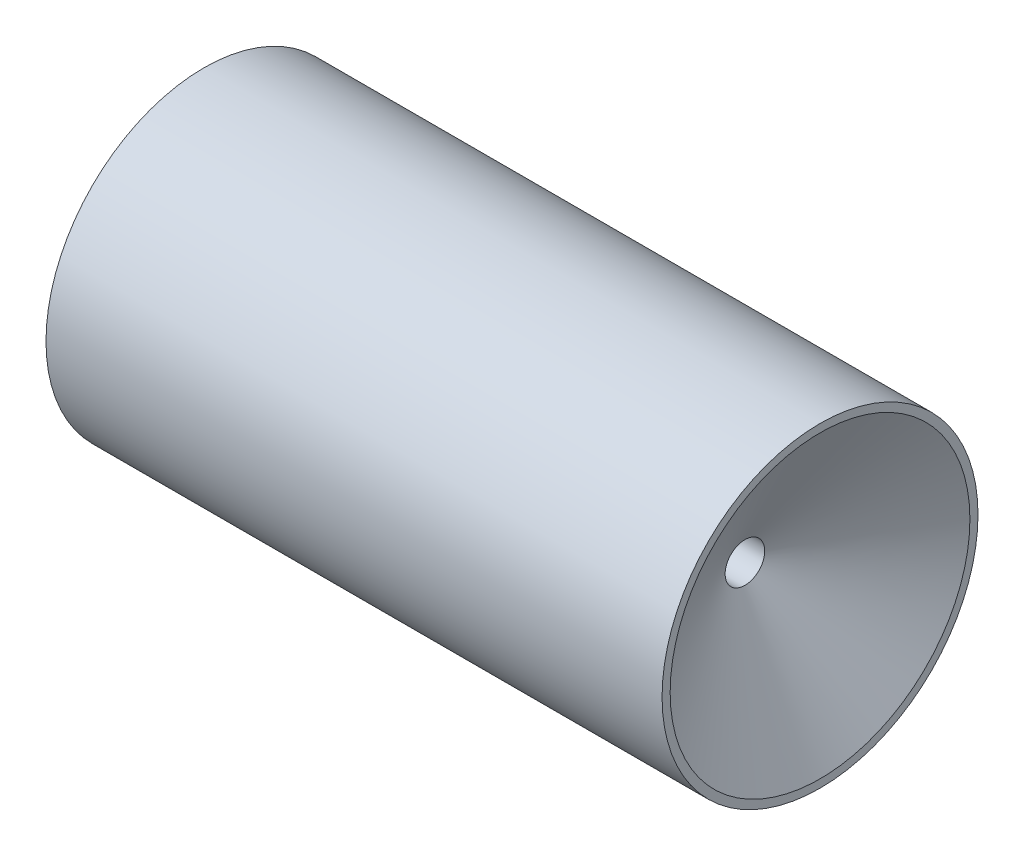
ISO-10303-21;
HEADER;
FILE_DESCRIPTION(('STEP AP214'),'2;1');
FILE_NAME('part.step','',(''),(''),'','','');
FILE_SCHEMA(('AUTOMOTIVE_DESIGN { 1 0 10303 214 1 1 1 1 }'));
ENDSEC;
DATA;
#1=APPLICATION_CONTEXT('core data for automotive mechanical design processes');
#2=APPLICATION_PROTOCOL_DEFINITION('international standard','automotive_design',2000,#1);
#3=PRODUCT_CONTEXT('',#1,'mechanical');
#4=PRODUCT('Part','Part','',(#3));
#5=PRODUCT_RELATED_PRODUCT_CATEGORY('part','',(#4));
#6=PRODUCT_DEFINITION_FORMATION('','',#4);
#7=PRODUCT_DEFINITION_CONTEXT('part definition',#1,'design');
#8=PRODUCT_DEFINITION('design','',#6,#7);
#9=PRODUCT_DEFINITION_SHAPE('','',#8);
#10=(LENGTH_UNIT() NAMED_UNIT(*) SI_UNIT(.MILLI.,.METRE.));
#11=(NAMED_UNIT(*) PLANE_ANGLE_UNIT() SI_UNIT($,.RADIAN.));
#12=(NAMED_UNIT(*) SI_UNIT($,.STERADIAN.) SOLID_ANGLE_UNIT());
#13=UNCERTAINTY_MEASURE_WITH_UNIT(LENGTH_MEASURE(1.E-05),#10,'distance_accuracy_value','');
#14=(GEOMETRIC_REPRESENTATION_CONTEXT(3) GLOBAL_UNCERTAINTY_ASSIGNED_CONTEXT((#13)) GLOBAL_UNIT_ASSIGNED_CONTEXT((#10,
#11,#12)) REPRESENTATION_CONTEXT('',''));
#15=CARTESIAN_POINT('',(0.,0.,0.));
#16=DIRECTION('',(0.,0.,1.));
#17=DIRECTION('',(1.,0.,0.));
#18=AXIS2_PLACEMENT_3D('',#15,#16,#17);
#19=CARTESIAN_POINT('',(-78.,9.99999999999999,0.));
#20=DIRECTION('',(-1.,0.,0.));
#21=DIRECTION('',(0.,0.,1.));
#22=AXIS2_PLACEMENT_3D('',#19,#20,#21);
#23=PLANE('',#22);
#24=CARTESIAN_POINT('',(-78.,0.,0.));
#25=DIRECTION('',(1.,0.,0.));
#26=DIRECTION('',(0.,0.,-1.));
#27=AXIS2_PLACEMENT_3D('',#24,#25,#26);
#28=CIRCLE('',#27,9.99999999999999);
#29=CARTESIAN_POINT('',(-78.,0.,9.99999999999999));
#30=VERTEX_POINT('',#29);
#31=EDGE_CURVE('E55',#30,#30,#28,.T.);
#32=ORIENTED_EDGE('',*,*,#31,.T.);
#33=EDGE_LOOP('',(#32));
#34=FACE_BOUND('',#33,.T.);
#35=CARTESIAN_POINT('',(-78.,0.,0.));
#36=DIRECTION('',(1.,0.,0.));
#37=DIRECTION('',(0.,0.,-1.));
#38=AXIS2_PLACEMENT_3D('',#35,#36,#37);
#39=CIRCLE('',#38,20.);
#40=CARTESIAN_POINT('',(-78.,0.,-20.));
#41=VERTEX_POINT('',#40);
#42=EDGE_CURVE('E10',#41,#41,#39,.T.);
#43=ORIENTED_EDGE('',*,*,#42,.F.);
#44=EDGE_LOOP('',(#43));
#45=FACE_BOUND('',#44,.T.);
#46=ADVANCED_FACE('F33',(#34,#45),#23,.T.);
#47=CARTESIAN_POINT('',(11.2723845428841,0.,0.));
#48=DIRECTION('',(1.,0.,0.));
#49=DIRECTION('',(0.,0.,-1.));
#50=AXIS2_PLACEMENT_3D('',#47,#48,#49);
#51=CYLINDRICAL_SURFACE('',#50,20.);
#52=ORIENTED_EDGE('',*,*,#42,.T.);
#53=EDGE_LOOP('',(#52));
#54=FACE_BOUND('',#53,.T.);
#55=CARTESIAN_POINT('',(0.,0.,0.));
#56=DIRECTION('',(1.,0.,0.));
#57=DIRECTION('',(0.,0.,-1.));
#58=AXIS2_PLACEMENT_3D('',#55,#56,#57);
#59=CIRCLE('',#58,20.);
#60=CARTESIAN_POINT('',(0.,0.,-20.));
#61=VERTEX_POINT('',#60);
#62=EDGE_CURVE('E39',#61,#61,#59,.T.);
#63=ORIENTED_EDGE('',*,*,#62,.F.);
#64=EDGE_LOOP('',(#63));
#65=FACE_BOUND('',#64,.T.);
#66=ADVANCED_FACE('F73',(#54,#65),#51,.T.);
#67=CARTESIAN_POINT('',(0.,20.,0.));
#68=DIRECTION('',(1.,0.,0.));
#69=DIRECTION('',(0.,0.,-1.));
#70=AXIS2_PLACEMENT_3D('',#67,#68,#69);
#71=PLANE('',#70);
#72=ORIENTED_EDGE('',*,*,#62,.T.);
#73=EDGE_LOOP('',(#72));
#74=FACE_BOUND('',#73,.T.);
#75=CARTESIAN_POINT('',(0.,0.,0.));
#76=DIRECTION('',(1.,0.,0.));
#77=DIRECTION('',(0.,0.,-1.));
#78=AXIS2_PLACEMENT_3D('',#75,#76,#77);
#79=CIRCLE('',#78,18.9760569613425);
#80=CARTESIAN_POINT('',(0.,0.,-18.9760569613425));
#81=VERTEX_POINT('',#80);
#82=EDGE_CURVE('E43',#81,#81,#79,.T.);
#83=ORIENTED_EDGE('',*,*,#82,.F.);
#84=EDGE_LOOP('',(#83));
#85=FACE_BOUND('',#84,.T.);
#86=ADVANCED_FACE('F77',(#74,#85),#71,.T.);
#87=CARTESIAN_POINT('',(-9.50841939862651,0.,0.));
#88=DIRECTION('',(1.,0.,0.));
#89=DIRECTION('',(0.,0.,-1.));
#90=AXIS2_PLACEMENT_3D('',#87,#88,#89);
#91=CONICAL_SURFACE('',#90,2.50699146324803,1.04719755119659);
#92=CARTESIAN_POINT('',(-9.50841939862651,0.,0.));
#93=DIRECTION('',(1.,0.,0.));
#94=DIRECTION('',(0.,0.,-1.));
#95=AXIS2_PLACEMENT_3D('',#92,#93,#94);
#96=CIRCLE('',#95,2.50699146324803);
#97=CARTESIAN_POINT('',(-9.50841939862651,0.,-2.50699146324803));
#98=VERTEX_POINT('',#97);
#99=EDGE_CURVE('E47',#98,#98,#96,.T.);
#100=CARTESIAN_POINT('',(0.,0.,-18.9760569613425));
#101=CARTESIAN_POINT('',(-0.0990460354023613,0.,-18.8045041957373));
#102=CARTESIAN_POINT('',(-0.198092070804721,0.,-18.6329514301322));
#103=CARTESIAN_POINT('',(-0.39618414160944,0.,-18.2898458989219));
#104=CARTESIAN_POINT('',(-0.495230177011799,0.,-18.1182931333167));
#105=CARTESIAN_POINT('',(-0.693322247816518,0.,-17.7751876021064));
#106=CARTESIAN_POINT('',(-0.792368283218878,0.,-17.6036348365013));
#107=CARTESIAN_POINT('',(-0.990460354023597,0.,-17.260529305291));
#108=CARTESIAN_POINT('',(-1.08950638942596,0.,-17.0889765396858));
#109=CARTESIAN_POINT('',(-1.28759846023067,0.,-16.7458710084755));
#110=CARTESIAN_POINT('',(-1.38664449563303,0.,-16.5743182428704));
#111=CARTESIAN_POINT('',(-1.58473656643775,0.,-16.2312127116601));
#112=CARTESIAN_POINT('',(-1.68378260184011,0.,-16.0596599460549));
#113=CARTESIAN_POINT('',(-1.88187467264483,0.,-15.7165544148446));
#114=CARTESIAN_POINT('',(-1.98092070804719,0.,-15.5450016492395));
#115=CARTESIAN_POINT('',(-2.17901277885191,0.,-15.2018961180292));
#116=CARTESIAN_POINT('',(-2.27805881425427,0.,-15.030343352424));
#117=CARTESIAN_POINT('',(-2.47615088505899,0.,-14.6872378212137));
#118=CARTESIAN_POINT('',(-2.57519692046135,0.,-14.5156850556086));
#119=CARTESIAN_POINT('',(-2.77328899126607,0.,-14.1725795243983));
#120=CARTESIAN_POINT('',(-2.87233502666843,0.,-14.0010267587931));
#121=CARTESIAN_POINT('',(-3.07042709747314,0.,-13.6579212275828));
#122=CARTESIAN_POINT('',(-3.1694731328755,0.,-13.4863684619777));
#123=CARTESIAN_POINT('',(-3.36756520368022,0.,-13.1432629307674));
#124=CARTESIAN_POINT('',(-3.46661123908258,0.,-12.9717101651622));
#125=CARTESIAN_POINT('',(-3.6647033098873,0.,-12.6286046339519));
#126=CARTESIAN_POINT('',(-3.76374934528966,0.,-12.4570518683468));
#127=CARTESIAN_POINT('',(-3.96184141609438,0.,-12.1139463371365));
#128=CARTESIAN_POINT('',(-4.06088745149674,0.,-11.9423935715313));
#129=CARTESIAN_POINT('',(-4.25897952230146,0.,-11.599288040321));
#130=CARTESIAN_POINT('',(-4.35802555770382,0.,-11.4277352747159));
#131=CARTESIAN_POINT('',(-4.55611762850853,0.,-11.0846297435056));
#132=CARTESIAN_POINT('',(-4.65516366391089,0.,-10.9130769779004));
#133=CARTESIAN_POINT('',(-4.85325573471561,0.,-10.5699714466901));
#134=CARTESIAN_POINT('',(-4.95230177011797,0.,-10.3984186810849));
#135=CARTESIAN_POINT('',(-5.15039384092269,0.,-10.0553131498746));
#136=CARTESIAN_POINT('',(-5.24943987632505,0.,-9.8837603842695));
#137=CARTESIAN_POINT('',(-5.44753194712977,0.,-9.5406548530592));
#138=CARTESIAN_POINT('',(-5.54657798253213,0.,-9.36910208745405));
#139=CARTESIAN_POINT('',(-5.74467005333685,0.,-9.02599655624375));
#140=CARTESIAN_POINT('',(-5.84371608873921,0.,-8.8544437906386));
#141=CARTESIAN_POINT('',(-6.04180815954393,0.,-8.51133825942829));
#142=CARTESIAN_POINT('',(-6.14085419494629,0.,-8.33978549382315));
#143=CARTESIAN_POINT('',(-6.338946265751,0.,-7.99667996261284));
#144=CARTESIAN_POINT('',(-6.43799230115336,0.,-7.8251271970077));
#145=CARTESIAN_POINT('',(-6.63608437195808,0.,-7.48202166579739));
#146=CARTESIAN_POINT('',(-6.73513040736044,0.,-7.31046890019224));
#147=CARTESIAN_POINT('',(-6.93322247816516,0.,-6.96736336898194));
#148=CARTESIAN_POINT('',(-7.03226851356752,0.,-6.79581060337679));
#149=CARTESIAN_POINT('',(-7.23036058437224,0.,-6.45270507216649));
#150=CARTESIAN_POINT('',(-7.3294066197746,0.,-6.28115230656134));
#151=CARTESIAN_POINT('',(-7.52749869057932,0.,-5.93804677535104));
#152=CARTESIAN_POINT('',(-7.62654472598168,0.,-5.76649400974589));
#153=CARTESIAN_POINT('',(-7.8246367967864,0.,-5.42338847853559));
#154=CARTESIAN_POINT('',(-7.92368283218875,0.,-5.25183571293044));
#155=CARTESIAN_POINT('',(-8.12177490299347,0.,-4.90873018172014));
#156=CARTESIAN_POINT('',(-8.22082093839583,0.,-4.73717741611499));
#157=CARTESIAN_POINT('',(-8.41891300920055,0.,-4.39407188490469));
#158=CARTESIAN_POINT('',(-8.51795904460291,0.,-4.22251911929954));
#159=CARTESIAN_POINT('',(-8.71605111540763,0.,-3.87941358808924));
#160=CARTESIAN_POINT('',(-8.81509715080999,0.,-3.70786082248409));
#161=CARTESIAN_POINT('',(-9.01318922161471,0.,-3.36475529127379));
#162=CARTESIAN_POINT('',(-9.11223525701707,0.,-3.19320252566864));
#163=CARTESIAN_POINT('',(-9.31032732782179,0.,-2.85009699445833));
#164=CARTESIAN_POINT('',(-9.40937336322415,0.,-2.67854422885318));
#165=CARTESIAN_POINT('',(-9.50841939862651,0.,-2.50699146324803));
#166=B_SPLINE_CURVE_WITH_KNOTS('',3,(#100,#101,#102,#103,#104,#105,#106,#107,#108,#109,#110,
#111,#112,#113,#114,#115,#116,#117,#118,#119,#120,#121,#122,#123,#124,#125,#126,#127,#128,#129,
#130,#131,#132,#133,#134,#135,#136,#137,#138,#139,#140,#141,#142,#143,#144,#145,#146,#147,#148,
#149,#150,#151,#152,#153,#154,#155,#156,#157,#158,#159,#160,#161,#162,#163,#164,#165),
.UNSPECIFIED.,.F.,.F.,(4,2,2,2,2,2,2,2,2,2,2,2,2,2,2,2,2,2,2,2,2,2,2,2,2,2,2,2,2,2,2,2,4),(0.,
0.594276212414152,1.1885524248283,1.78282863724246,2.37710484965661,2.97138106207076,
3.56565727448491,4.15993348689906,4.75420969931321,5.34848591172737,5.94276212414152,
6.53703833655567,7.13131454896982,7.72559076138397,8.31986697379812,8.91414318621228,
9.50841939862643,10.1026956110406,10.6969718234547,11.2912480358689,11.885524248283,
12.4798004606972,13.0740766731113,13.6683528855255,14.2626290979396,14.8569053103538,
15.4511815227679,16.0454577351821,16.6397339475962,17.2340101600104,17.8282863724245,
18.4225625848387,19.0168387972529),.UNSPECIFIED.);
#167=EDGE_CURVE('BSEAM69',#81,#98,#166,.T.);
#168=ORIENTED_EDGE('',*,*,#82,.T.);
#169=ORIENTED_EDGE('',*,*,#99,.F.);
#170=ORIENTED_EDGE('',*,*,#167,.T.);
#171=ORIENTED_EDGE('',*,*,#167,.F.);
#172=EDGE_LOOP('',(#168,#170,#169,#171));
#173=FACE_BOUND('',#172,.T.);
#174=ADVANCED_FACE('F69',(#173),#91,.F.);
#175=CARTESIAN_POINT('',(11.2723845428841,0.,0.));
#176=DIRECTION('',(1.,0.,0.));
#177=DIRECTION('',(0.,0.,-1.));
#178=AXIS2_PLACEMENT_3D('',#175,#176,#177);
#179=CYLINDRICAL_SURFACE('',#178,2.50699146324803);
#180=ORIENTED_EDGE('',*,*,#99,.T.);
#181=EDGE_LOOP('',(#180));
#182=FACE_BOUND('',#181,.T.);
#183=CARTESIAN_POINT('',(-50.0357114392944,0.,0.));
#184=DIRECTION('',(1.,0.,0.));
#185=DIRECTION('',(0.,0.,-1.));
#186=AXIS2_PLACEMENT_3D('',#183,#184,#185);
#187=CIRCLE('',#186,2.50699146324804);
#188=CARTESIAN_POINT('',(-50.0357114392945,0.,2.50699146324804));
#189=VERTEX_POINT('',#188);
#190=EDGE_CURVE('E52',#189,#189,#187,.T.);
#191=ORIENTED_EDGE('',*,*,#190,.F.);
#192=EDGE_LOOP('',(#191));
#193=FACE_BOUND('',#192,.T.);
#194=ADVANCED_FACE('F63',(#182,#193),#179,.F.);
#195=CARTESIAN_POINT('',(-78.,0.,0.));
#196=DIRECTION('',(-1.,0.,0.));
#197=DIRECTION('',(0.,0.,1.));
#198=AXIS2_PLACEMENT_3D('',#195,#196,#197);
#199=CONICAL_SURFACE('',#198,9.99999999999999,0.26179938779915);
#200=CARTESIAN_POINT('',(-50.0357114392945,0.,2.50699146324804));
#201=CARTESIAN_POINT('',(-50.3270061118018,0.,2.58504363550587));
#202=CARTESIAN_POINT('',(-50.6183007843091,0.,2.6630958077637));
#203=CARTESIAN_POINT('',(-51.2008901293239,0.,2.81920015227937));
#204=CARTESIAN_POINT('',(-51.4921848018312,0.,2.8972523245372));
#205=CARTESIAN_POINT('',(-52.0747741468459,0.,3.05335666905287));
#206=CARTESIAN_POINT('',(-52.3660688193532,0.,3.1314088413107));
#207=CARTESIAN_POINT('',(-52.9486581643679,0.,3.28751318582637));
#208=CARTESIAN_POINT('',(-53.2399528368753,0.,3.3655653580842));
#209=CARTESIAN_POINT('',(-53.82254218189,0.,3.52166970259986));
#210=CARTESIAN_POINT('',(-54.1138368543973,0.,3.5997218748577));
#211=CARTESIAN_POINT('',(-54.696426199412,0.,3.75582621937336));
#212=CARTESIAN_POINT('',(-54.9877208719194,0.,3.8338783916312));
#213=CARTESIAN_POINT('',(-55.5703102169341,0.,3.98998273614686));
#214=CARTESIAN_POINT('',(-55.8616048894414,0.,4.0680349084047));
#215=CARTESIAN_POINT('',(-56.4441942344561,0.,4.22413925292036));
#216=CARTESIAN_POINT('',(-56.7354889069635,0.,4.30219142517819));
#217=CARTESIAN_POINT('',(-57.3180782519782,0.,4.45829576969386));
#218=CARTESIAN_POINT('',(-57.6093729244855,0.,4.53634794195169));
#219=CARTESIAN_POINT('',(-58.1919622695002,0.,4.69245228646736));
#220=CARTESIAN_POINT('',(-58.4832569420076,0.,4.77050445872519));
#221=CARTESIAN_POINT('',(-59.0658462870223,0.,4.92660880324086));
#222=CARTESIAN_POINT('',(-59.3571409595296,0.,5.00466097549869));
#223=CARTESIAN_POINT('',(-59.9397303045443,0.,5.16076532001436));
#224=CARTESIAN_POINT('',(-60.2310249770517,0.,5.23881749227219));
#225=CARTESIAN_POINT('',(-60.8136143220664,0.,5.39492183678785));
#226=CARTESIAN_POINT('',(-61.1049089945737,0.,5.47297400904569));
#227=CARTESIAN_POINT('',(-61.6874983395884,0.,5.62907835356135));
#228=CARTESIAN_POINT('',(-61.9787930120958,0.,5.70713052581918));
#229=CARTESIAN_POINT('',(-62.5613823571105,0.,5.86323487033485));
#230=CARTESIAN_POINT('',(-62.8526770296178,0.,5.94128704259268));
#231=CARTESIAN_POINT('',(-63.4352663746325,0.,6.09739138710835));
#232=CARTESIAN_POINT('',(-63.7265610471399,0.,6.17544355936618));
#233=CARTESIAN_POINT('',(-64.3091503921546,0.,6.33154790388185));
#234=CARTESIAN_POINT('',(-64.6004450646619,0.,6.40960007613968));
#235=CARTESIAN_POINT('',(-65.1830344096766,0.,6.56570442065535));
#236=CARTESIAN_POINT('',(-65.474329082184,0.,6.64375659291318));
#237=CARTESIAN_POINT('',(-66.0569184271987,0.,6.79986093742884));
#238=CARTESIAN_POINT('',(-66.348213099706,0.,6.87791310968668));
#239=CARTESIAN_POINT('',(-66.9308024447207,0.,7.03401745420234));
#240=CARTESIAN_POINT('',(-67.2220971172281,0.,7.11206962646018));
#241=CARTESIAN_POINT('',(-67.8046864622428,0.,7.26817397097584));
#242=CARTESIAN_POINT('',(-68.0959811347501,0.,7.34622614323367));
#243=CARTESIAN_POINT('',(-68.6785704797648,0.,7.50233048774934));
#244=CARTESIAN_POINT('',(-68.9698651522722,0.,7.58038266000717));
#245=CARTESIAN_POINT('',(-69.5524544972869,0.,7.73648700452284));
#246=CARTESIAN_POINT('',(-69.8437491697942,0.,7.81453917678067));
#247=CARTESIAN_POINT('',(-70.4263385148089,0.,7.97064352129634));
#248=CARTESIAN_POINT('',(-70.7176331873163,0.,8.04869569355417));
#249=CARTESIAN_POINT('',(-71.300222532331,0.,8.20480003806984));
#250=CARTESIAN_POINT('',(-71.5915172048383,0.,8.28285221032767));
#251=CARTESIAN_POINT('',(-72.174106549853,0.,8.43895655484333));
#252=CARTESIAN_POINT('',(-72.4654012223604,0.,8.51700872710117));
#253=CARTESIAN_POINT('',(-73.0479905673751,0.,8.67311307161683));
#254=CARTESIAN_POINT('',(-73.3392852398824,0.,8.75116524387466));
#255=CARTESIAN_POINT('',(-73.9218745848971,0.,8.90726958839033));
#256=CARTESIAN_POINT('',(-74.2131692574045,0.,8.98532176064817));
#257=CARTESIAN_POINT('',(-74.7957586024192,0.,9.14142610516383));
#258=CARTESIAN_POINT('',(-75.0870532749265,0.,9.21947827742166));
#259=CARTESIAN_POINT('',(-75.6696426199412,0.,9.37558262193733));
#260=CARTESIAN_POINT('',(-75.9609372924486,0.,9.45363479419516));
#261=CARTESIAN_POINT('',(-76.5435266374633,0.,9.60973913871083));
#262=CARTESIAN_POINT('',(-76.8348213099706,0.,9.68779131096866));
#263=CARTESIAN_POINT('',(-77.4174106549853,0.,9.84389565548433));
#264=CARTESIAN_POINT('',(-77.7087053274927,0.,9.92194782774216));
#265=CARTESIAN_POINT('',(-78.,0.,9.99999999999999));
#266=B_SPLINE_CURVE_WITH_KNOTS('',3,(#200,#201,#202,#203,#204,#205,#206,#207,#208,#209,#210,
#211,#212,#213,#214,#215,#216,#217,#218,#219,#220,#221,#222,#223,#224,#225,#226,#227,#228,#229,
#230,#231,#232,#233,#234,#235,#236,#237,#238,#239,#240,#241,#242,#243,#244,#245,#246,#247,#248,
#249,#250,#251,#252,#253,#254,#255,#256,#257,#258,#259,#260,#261,#262,#263,#264,#265),
.UNSPECIFIED.,.F.,.F.,(4,2,2,2,2,2,2,2,2,2,2,2,2,2,2,2,2,2,2,2,2,2,2,2,2,2,2,2,2,2,2,2,4),(0.,
0.904711307781648,1.80942261556329,2.71413392334493,3.61884523112658,4.52355653890822,
5.42826784668987,6.33297915447151,7.23769046225316,8.1424017700348,9.04711307781644,
9.95182438559809,10.8565356933797,11.7612470011614,12.665958308943,13.5706696167247,
14.4753809245063,15.380092232288,16.2848035400696,17.1895148478513,18.0942261556329,
18.9989374634145,19.9036487711962,20.8083600789778,21.7130713867595,22.6177826945411,
23.5224940023228,24.4272053101044,25.331916617886,26.2366279256677,27.1413392334493,
28.046050541231,28.9507618490126),.UNSPECIFIED.);
#267=EDGE_CURVE('BSEAM61',#189,#30,#266,.T.);
#268=ORIENTED_EDGE('',*,*,#190,.T.);
#269=ORIENTED_EDGE('',*,*,#31,.F.);
#270=ORIENTED_EDGE('',*,*,#267,.T.);
#271=ORIENTED_EDGE('',*,*,#267,.F.);
#272=EDGE_LOOP('',(#268,#270,#269,#271));
#273=FACE_BOUND('',#272,.T.);
#274=ADVANCED_FACE('F61',(#273),#199,.F.);
#275=CLOSED_SHELL('',(#46,#66,#86,#174,#194,#274));
#276=MANIFOLD_SOLID_BREP('B2',#275);
#277=ADVANCED_BREP_SHAPE_REPRESENTATION('',(#18,#276),#14);
#278=SHAPE_DEFINITION_REPRESENTATION(#9,#277);
ENDSEC;
END-ISO-10303-21;
